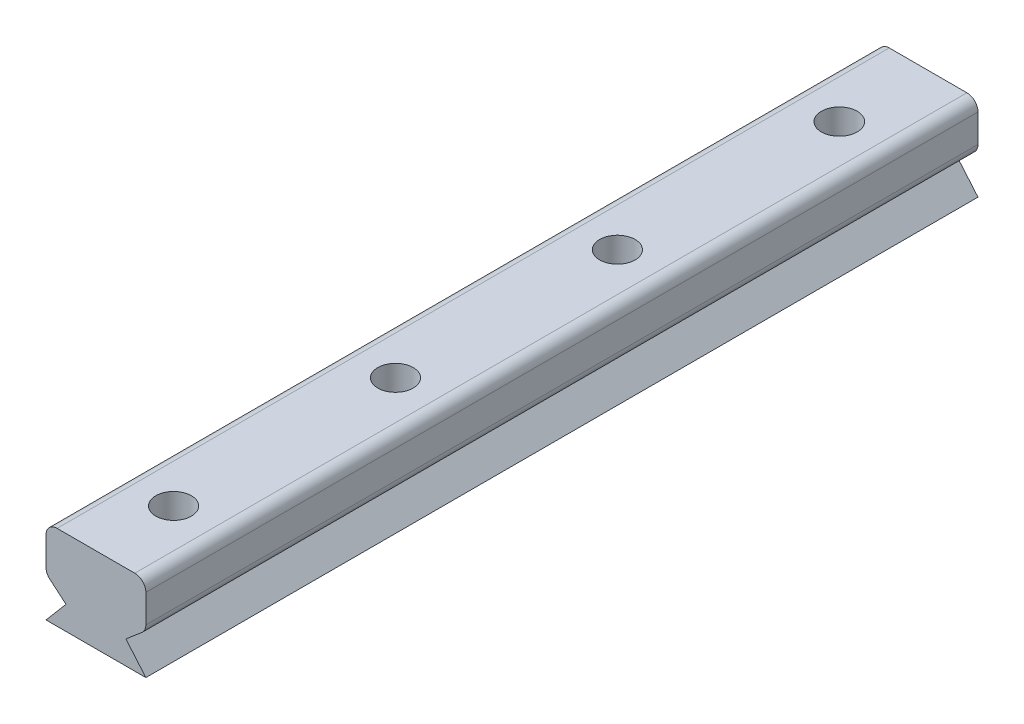
ISO-10303-21;
HEADER;
FILE_DESCRIPTION(('STEP AP214'),'2;1');
FILE_NAME('part.step','',(''),(''),'','','');
FILE_SCHEMA(('AUTOMOTIVE_DESIGN { 1 0 10303 214 1 1 1 1 }'));
ENDSEC;
DATA;
#1=APPLICATION_CONTEXT('core data for automotive mechanical design processes');
#2=APPLICATION_PROTOCOL_DEFINITION('international standard','automotive_design',2000,#1);
#3=PRODUCT_CONTEXT('',#1,'mechanical');
#4=PRODUCT('Part','Part','',(#3));
#5=PRODUCT_RELATED_PRODUCT_CATEGORY('part','',(#4));
#6=PRODUCT_DEFINITION_FORMATION('','',#4);
#7=PRODUCT_DEFINITION_CONTEXT('part definition',#1,'design');
#8=PRODUCT_DEFINITION('design','',#6,#7);
#9=PRODUCT_DEFINITION_SHAPE('','',#8);
#10=(LENGTH_UNIT() NAMED_UNIT(*) SI_UNIT(.MILLI.,.METRE.));
#11=(NAMED_UNIT(*) PLANE_ANGLE_UNIT() SI_UNIT($,.RADIAN.));
#12=(NAMED_UNIT(*) SI_UNIT($,.STERADIAN.) SOLID_ANGLE_UNIT());
#13=UNCERTAINTY_MEASURE_WITH_UNIT(LENGTH_MEASURE(1.E-05),#10,'distance_accuracy_value','');
#14=(GEOMETRIC_REPRESENTATION_CONTEXT(3) GLOBAL_UNCERTAINTY_ASSIGNED_CONTEXT((#13)) GLOBAL_UNIT_ASSIGNED_CONTEXT((#10,
#11,#12)) REPRESENTATION_CONTEXT('',''));
#15=CARTESIAN_POINT('',(0.,0.,0.));
#16=DIRECTION('',(0.,0.,1.));
#17=DIRECTION('',(1.,0.,0.));
#18=AXIS2_PLACEMENT_3D('',#15,#16,#17);
#19=CARTESIAN_POINT('',(0.,-4.,75.));
#20=DIRECTION('',(1.,0.,0.));
#21=DIRECTION('',(0.,0.,-1.));
#22=AXIS2_PLACEMENT_3D('',#19,#20,#21);
#23=PLANE('',#22);
#24=DIRECTION('',(0.,-1.,0.));
#25=VECTOR('',#24,1.);
#26=CARTESIAN_POINT('',(0.,-4.,0.));
#27=LINE('',#26,#25);
#28=CARTESIAN_POINT('',(0.,-1.,0.));
#29=VERTEX_POINT('',#28);
#30=CARTESIAN_POINT('',(0.,-3.53742585287471,0.));
#31=VERTEX_POINT('',#30);
#32=EDGE_CURVE('E164',#29,#31,#27,.T.);
#33=ORIENTED_EDGE('',*,*,#32,.T.);
#34=DIRECTION('',(0.,0.,-1.));
#35=VECTOR('',#34,1.);
#36=CARTESIAN_POINT('',(0.,-3.53742585287471,75.));
#37=LINE('',#36,#35);
#38=CARTESIAN_POINT('',(0.,-3.53742585287471,75.));
#39=VERTEX_POINT('',#38);
#40=EDGE_CURVE('E212',#31,#39,#37,.F.);
#41=ORIENTED_EDGE('',*,*,#40,.T.);
#42=DIRECTION('',(0.,-1.,0.));
#43=VECTOR('',#42,1.);
#44=CARTESIAN_POINT('',(0.,-4.,75.));
#45=LINE('',#44,#43);
#46=CARTESIAN_POINT('',(0.,-1.,75.));
#47=VERTEX_POINT('',#46);
#48=EDGE_CURVE('E134',#47,#39,#45,.T.);
#49=ORIENTED_EDGE('',*,*,#48,.F.);
#50=DIRECTION('',(0.,0.,-1.));
#51=VECTOR('',#50,1.);
#52=CARTESIAN_POINT('',(0.,-1.,75.));
#53=LINE('',#52,#51);
#54=EDGE_CURVE('E203',#47,#29,#53,.T.);
#55=ORIENTED_EDGE('',*,*,#54,.T.);
#56=EDGE_LOOP('',(#33,#41,#49,#55));
#57=FACE_BOUND('',#56,.T.);
#58=ADVANCED_FACE('F33',(#57),#23,.F.);
#59=CARTESIAN_POINT('',(1.8,-5.52931729316591,75.));
#60=DIRECTION('',(0.647480599666021,0.762081933295974,0.));
#61=DIRECTION('',(-0.762081933295974,0.647480599666022,0.));
#62=AXIS2_PLACEMENT_3D('',#59,#60,#61);
#63=PLANE('',#62);
#64=DIRECTION('',(0.762081933295974,-0.647480599666021,0.));
#65=VECTOR('',#64,1.);
#66=CARTESIAN_POINT('',(1.8,-5.52931729316591,75.));
#67=LINE('',#66,#65);
#68=CARTESIAN_POINT('',(0.352519400333979,-4.29950778617068,75.));
#69=VERTEX_POINT('',#68);
#70=CARTESIAN_POINT('',(1.8,-5.52931729316591,75.));
#71=VERTEX_POINT('',#70);
#72=EDGE_CURVE('E122',#69,#71,#67,.T.);
#73=ORIENTED_EDGE('',*,*,#72,.F.);
#74=DIRECTION('',(0.,0.,-1.));
#75=VECTOR('',#74,1.);
#76=CARTESIAN_POINT('',(0.352519400333979,-4.29950778617068,75.));
#77=LINE('',#76,#75);
#78=CARTESIAN_POINT('',(0.352519400333979,-4.29950778617068,0.));
#79=VERTEX_POINT('',#78);
#80=EDGE_CURVE('E206',#69,#79,#77,.T.);
#81=ORIENTED_EDGE('',*,*,#80,.T.);
#82=DIRECTION('',(0.762081933295974,-0.647480599666021,0.));
#83=VECTOR('',#82,1.);
#84=CARTESIAN_POINT('',(1.8,-5.52931729316591,0.));
#85=LINE('',#84,#83);
#86=CARTESIAN_POINT('',(1.8,-5.52931729316591,0.));
#87=VERTEX_POINT('',#86);
#88=EDGE_CURVE('E140',#79,#87,#85,.T.);
#89=ORIENTED_EDGE('',*,*,#88,.T.);
#90=DIRECTION('',(0.,0.,-1.));
#91=VECTOR('',#90,1.);
#92=CARTESIAN_POINT('',(1.8,-5.52931729316591,75.));
#93=LINE('',#92,#91);
#94=EDGE_CURVE('E137',#71,#87,#93,.T.);
#95=ORIENTED_EDGE('',*,*,#94,.F.);
#96=EDGE_LOOP('',(#73,#81,#89,#95));
#97=FACE_BOUND('',#96,.T.);
#98=ADVANCED_FACE('F138',(#97),#63,.F.);
#99=CARTESIAN_POINT('',(0.,-7.64790969676891,75.));
#100=DIRECTION('',(0.762081933295974,-0.647480599666022,0.));
#101=DIRECTION('',(0.647480599666022,0.762081933295974,0.));
#102=AXIS2_PLACEMENT_3D('',#99,#100,#101);
#103=PLANE('',#102);
#104=DIRECTION('',(-0.647480599666022,-0.762081933295974,0.));
#105=VECTOR('',#104,1.);
#106=CARTESIAN_POINT('',(0.,-7.64790969676891,0.));
#107=LINE('',#106,#105);
#108=CARTESIAN_POINT('',(0.,-7.64790969676891,0.));
#109=VERTEX_POINT('',#108);
#110=EDGE_CURVE('E168',#87,#109,#107,.T.);
#111=ORIENTED_EDGE('',*,*,#110,.T.);
#112=DIRECTION('',(0.,0.,-1.));
#113=VECTOR('',#112,1.);
#114=CARTESIAN_POINT('',(0.,-7.64790969676891,75.));
#115=LINE('',#114,#113);
#116=CARTESIAN_POINT('',(0.,-7.64790969676891,75.));
#117=VERTEX_POINT('',#116);
#118=EDGE_CURVE('E144',#117,#109,#115,.T.);
#119=ORIENTED_EDGE('',*,*,#118,.F.);
#120=DIRECTION('',(-0.647480599666022,-0.762081933295974,0.));
#121=VECTOR('',#120,1.);
#122=CARTESIAN_POINT('',(0.,-7.64790969676891,75.));
#123=LINE('',#122,#121);
#124=EDGE_CURVE('E127',#71,#117,#123,.T.);
#125=ORIENTED_EDGE('',*,*,#124,.F.);
#126=ORIENTED_EDGE('',*,*,#94,.T.);
#127=EDGE_LOOP('',(#111,#119,#125,#126));
#128=FACE_BOUND('',#127,.T.);
#129=ADVANCED_FACE('F146',(#128),#103,.F.);
#130=CARTESIAN_POINT('',(9.,-7.64790969676891,75.));
#131=DIRECTION('',(0.,1.,0.));
#132=DIRECTION('',(0.,0.,1.));
#133=AXIS2_PLACEMENT_3D('',#130,#131,#132);
#134=PLANE('',#133);
#135=CARTESIAN_POINT('',(4.50000000000001,-7.64790969676891,7.99999999999999));
#136=DIRECTION('',(0.,-1.,0.));
#137=DIRECTION('',(0.,0.,-1.));
#138=AXIS2_PLACEMENT_3D('',#135,#136,#137);
#139=CIRCLE('',#138,1.61718357872705);
#140=CARTESIAN_POINT('',(4.50000000000001,-7.64790969676891,6.38281642127293));
#141=VERTEX_POINT('',#140);
#142=EDGE_CURVE('E222',#141,#141,#139,.T.);
#143=ORIENTED_EDGE('',*,*,#142,.F.);
#144=EDGE_LOOP('',(#143));
#145=FACE_BOUND('',#144,.T.);
#146=CARTESIAN_POINT('',(4.5,-7.64790969676891,68.));
#147=DIRECTION('',(0.,-1.,0.));
#148=DIRECTION('',(0.,0.,-1.));
#149=AXIS2_PLACEMENT_3D('',#146,#147,#148);
#150=CIRCLE('',#149,1.6);
#151=CARTESIAN_POINT('',(4.5,-7.64790969676891,66.4));
#152=VERTEX_POINT('',#151);
#153=EDGE_CURVE('E430',#152,#152,#150,.T.);
#154=ORIENTED_EDGE('',*,*,#153,.F.);
#155=EDGE_LOOP('',(#154));
#156=FACE_BOUND('',#155,.T.);
#157=CARTESIAN_POINT('',(4.5,-7.64790969676891,48.));
#158=DIRECTION('',(0.,-1.,0.));
#159=DIRECTION('',(0.,0.,-1.));
#160=AXIS2_PLACEMENT_3D('',#157,#158,#159);
#161=CIRCLE('',#160,1.59999999999999);
#162=CARTESIAN_POINT('',(4.5,-7.64790969676891,46.4));
#163=VERTEX_POINT('',#162);
#164=EDGE_CURVE('E409',#163,#163,#161,.T.);
#165=ORIENTED_EDGE('',*,*,#164,.F.);
#166=EDGE_LOOP('',(#165));
#167=FACE_BOUND('',#166,.T.);
#168=CARTESIAN_POINT('',(4.50000000000001,-7.64790969676891,28.));
#169=DIRECTION('',(0.,-1.,0.));
#170=DIRECTION('',(0.,0.,-1.));
#171=AXIS2_PLACEMENT_3D('',#168,#169,#170);
#172=CIRCLE('',#171,1.6);
#173=CARTESIAN_POINT('',(4.50000000000001,-7.64790969676891,26.4));
#174=VERTEX_POINT('',#173);
#175=EDGE_CURVE('E426',#174,#174,#172,.T.);
#176=ORIENTED_EDGE('',*,*,#175,.F.);
#177=EDGE_LOOP('',(#176));
#178=FACE_BOUND('',#177,.T.);
#179=DIRECTION('',(1.,0.,0.));
#180=VECTOR('',#179,1.);
#181=CARTESIAN_POINT('',(9.,-7.64790969676891,0.));
#182=LINE('',#181,#180);
#183=CARTESIAN_POINT('',(9.,-7.64790969676891,0.));
#184=VERTEX_POINT('',#183);
#185=EDGE_CURVE('E170',#109,#184,#182,.T.);
#186=ORIENTED_EDGE('',*,*,#185,.T.);
#187=DIRECTION('',(0.,0.,-1.));
#188=VECTOR('',#187,1.);
#189=CARTESIAN_POINT('',(9.,-7.64790969676891,75.));
#190=LINE('',#189,#188);
#191=CARTESIAN_POINT('',(9.,-7.64790969676891,75.));
#192=VERTEX_POINT('',#191);
#193=EDGE_CURVE('E183',#192,#184,#190,.T.);
#194=ORIENTED_EDGE('',*,*,#193,.F.);
#195=DIRECTION('',(1.,0.,0.));
#196=VECTOR('',#195,1.);
#197=CARTESIAN_POINT('',(9.,-7.64790969676891,75.));
#198=LINE('',#197,#196);
#199=EDGE_CURVE('E149',#117,#192,#198,.T.);
#200=ORIENTED_EDGE('',*,*,#199,.F.);
#201=ORIENTED_EDGE('',*,*,#118,.T.);
#202=EDGE_LOOP('',(#186,#194,#200,#201));
#203=FACE_BOUND('',#202,.T.);
#204=ADVANCED_FACE('F276',(#145,#156,#167,#178,#203),#134,.F.);
#205=CARTESIAN_POINT('',(7.2,-5.52931729316591,75.));
#206=DIRECTION('',(-0.762081933295974,-0.647480599666022,0.));
#207=DIRECTION('',(0.647480599666022,-0.762081933295974,0.));
#208=AXIS2_PLACEMENT_3D('',#205,#206,#207);
#209=PLANE('',#208);
#210=DIRECTION('',(-0.647480599666022,0.762081933295974,0.));
#211=VECTOR('',#210,1.);
#212=CARTESIAN_POINT('',(7.2,-5.52931729316591,0.));
#213=LINE('',#212,#211);
#214=CARTESIAN_POINT('',(7.2,-5.52931729316591,0.));
#215=VERTEX_POINT('',#214);
#216=EDGE_CURVE('E172',#184,#215,#213,.T.);
#217=ORIENTED_EDGE('',*,*,#216,.T.);
#218=DIRECTION('',(0.,0.,-1.));
#219=VECTOR('',#218,1.);
#220=CARTESIAN_POINT('',(7.2,-5.52931729316591,75.));
#221=LINE('',#220,#219);
#222=CARTESIAN_POINT('',(7.2,-5.52931729316591,75.));
#223=VERTEX_POINT('',#222);
#224=EDGE_CURVE('E163',#223,#215,#221,.T.);
#225=ORIENTED_EDGE('',*,*,#224,.F.);
#226=DIRECTION('',(-0.647480599666022,0.762081933295974,0.));
#227=VECTOR('',#226,1.);
#228=CARTESIAN_POINT('',(7.2,-5.52931729316591,75.));
#229=LINE('',#228,#227);
#230=EDGE_CURVE('E151',#192,#223,#229,.T.);
#231=ORIENTED_EDGE('',*,*,#230,.F.);
#232=ORIENTED_EDGE('',*,*,#193,.T.);
#233=EDGE_LOOP('',(#217,#225,#231,#232));
#234=FACE_BOUND('',#233,.T.);
#235=ADVANCED_FACE('F281',(#234),#209,.F.);
#236=CARTESIAN_POINT('',(9.,-4.,75.));
#237=DIRECTION('',(-0.647480599666021,0.762081933295974,0.));
#238=DIRECTION('',(-0.762081933295974,-0.647480599666021,0.));
#239=AXIS2_PLACEMENT_3D('',#236,#237,#238);
#240=PLANE('',#239);
#241=DIRECTION('',(0.762081933295974,0.647480599666021,0.));
#242=VECTOR('',#241,1.);
#243=CARTESIAN_POINT('',(9.,-4.,0.));
#244=LINE('',#243,#242);
#245=CARTESIAN_POINT('',(8.64748059966602,-4.29950778617068,0.));
#246=VERTEX_POINT('',#245);
#247=EDGE_CURVE('E174',#215,#246,#244,.T.);
#248=ORIENTED_EDGE('',*,*,#247,.T.);
#249=DIRECTION('',(0.,0.,-1.));
#250=VECTOR('',#249,1.);
#251=CARTESIAN_POINT('',(8.64748059966602,-4.29950778617068,75.));
#252=LINE('',#251,#250);
#253=CARTESIAN_POINT('',(8.64748059966602,-4.29950778617068,75.));
#254=VERTEX_POINT('',#253);
#255=EDGE_CURVE('E11',#246,#254,#252,.F.);
#256=ORIENTED_EDGE('',*,*,#255,.T.);
#257=DIRECTION('',(0.762081933295974,0.647480599666021,0.));
#258=VECTOR('',#257,1.);
#259=CARTESIAN_POINT('',(9.,-4.,75.));
#260=LINE('',#259,#258);
#261=EDGE_CURVE('E156',#223,#254,#260,.T.);
#262=ORIENTED_EDGE('',*,*,#261,.F.);
#263=ORIENTED_EDGE('',*,*,#224,.T.);
#264=EDGE_LOOP('',(#248,#256,#262,#263));
#265=FACE_BOUND('',#264,.T.);
#266=ADVANCED_FACE('F283',(#265),#240,.F.);
#267=CARTESIAN_POINT('',(9.,0.,75.));
#268=DIRECTION('',(-1.,0.,0.));
#269=DIRECTION('',(0.,0.,1.));
#270=AXIS2_PLACEMENT_3D('',#267,#268,#269);
#271=PLANE('',#270);
#272=DIRECTION('',(0.,1.,0.));
#273=VECTOR('',#272,1.);
#274=CARTESIAN_POINT('',(9.,0.,75.));
#275=LINE('',#274,#273);
#276=CARTESIAN_POINT('',(9.,-3.53742585287471,75.));
#277=VERTEX_POINT('',#276);
#278=CARTESIAN_POINT('',(9.,-1.,75.));
#279=VERTEX_POINT('',#278);
#280=EDGE_CURVE('E158',#277,#279,#275,.T.);
#281=ORIENTED_EDGE('',*,*,#280,.F.);
#282=DIRECTION('',(0.,0.,-1.));
#283=VECTOR('',#282,1.);
#284=CARTESIAN_POINT('',(9.,-3.53742585287471,75.));
#285=LINE('',#284,#283);
#286=CARTESIAN_POINT('',(9.,-3.53742585287471,0.));
#287=VERTEX_POINT('',#286);
#288=EDGE_CURVE('E42',#277,#287,#285,.T.);
#289=ORIENTED_EDGE('',*,*,#288,.T.);
#290=DIRECTION('',(0.,1.,0.));
#291=VECTOR('',#290,1.);
#292=CARTESIAN_POINT('',(9.,0.,0.));
#293=LINE('',#292,#291);
#294=CARTESIAN_POINT('',(9.,-1.,0.));
#295=VERTEX_POINT('',#294);
#296=EDGE_CURVE('E176',#287,#295,#293,.T.);
#297=ORIENTED_EDGE('',*,*,#296,.T.);
#298=DIRECTION('',(0.,0.,-1.));
#299=VECTOR('',#298,1.);
#300=CARTESIAN_POINT('',(9.,-1.,75.));
#301=LINE('',#300,#299);
#302=EDGE_CURVE('E196',#295,#279,#301,.F.);
#303=ORIENTED_EDGE('',*,*,#302,.T.);
#304=EDGE_LOOP('',(#281,#289,#297,#303));
#305=FACE_BOUND('',#304,.T.);
#306=ADVANCED_FACE('F285',(#305),#271,.F.);
#307=CARTESIAN_POINT('',(0.,0.,75.));
#308=DIRECTION('',(0.,-1.,0.));
#309=DIRECTION('',(0.,0.,-1.));
#310=AXIS2_PLACEMENT_3D('',#307,#308,#309);
#311=PLANE('',#310);
#312=CARTESIAN_POINT('',(4.50000000000001,0.,7.99999999999999));
#313=DIRECTION('',(0.,-1.,0.));
#314=DIRECTION('',(0.,0.,-1.));
#315=AXIS2_PLACEMENT_3D('',#312,#313,#314);
#316=CIRCLE('',#315,1.61718357872705);
#317=CARTESIAN_POINT('',(4.50000000000001,0.,6.38281642127293));
#318=VERTEX_POINT('',#317);
#319=EDGE_CURVE('E37',#318,#318,#316,.T.);
#320=ORIENTED_EDGE('',*,*,#319,.T.);
#321=EDGE_LOOP('',(#320));
#322=FACE_BOUND('',#321,.T.);
#323=CARTESIAN_POINT('',(4.5,0.,68.));
#324=DIRECTION('',(0.,-1.,0.));
#325=DIRECTION('',(0.,0.,-1.));
#326=AXIS2_PLACEMENT_3D('',#323,#324,#325);
#327=CIRCLE('',#326,1.6);
#328=CARTESIAN_POINT('',(4.5,0.,66.4));
#329=VERTEX_POINT('',#328);
#330=EDGE_CURVE('E224',#329,#329,#327,.T.);
#331=ORIENTED_EDGE('',*,*,#330,.T.);
#332=EDGE_LOOP('',(#331));
#333=FACE_BOUND('',#332,.T.);
#334=CARTESIAN_POINT('',(4.5,0.,48.));
#335=DIRECTION('',(0.,-1.,0.));
#336=DIRECTION('',(0.,0.,-1.));
#337=AXIS2_PLACEMENT_3D('',#334,#335,#336);
#338=CIRCLE('',#337,1.59999999999999);
#339=CARTESIAN_POINT('',(4.5,0.,46.4));
#340=VERTEX_POINT('',#339);
#341=EDGE_CURVE('E221',#340,#340,#338,.T.);
#342=ORIENTED_EDGE('',*,*,#341,.T.);
#343=EDGE_LOOP('',(#342));
#344=FACE_BOUND('',#343,.T.);
#345=CARTESIAN_POINT('',(4.50000000000001,0.,28.));
#346=DIRECTION('',(0.,-1.,0.));
#347=DIRECTION('',(0.,0.,-1.));
#348=AXIS2_PLACEMENT_3D('',#345,#346,#347);
#349=CIRCLE('',#348,1.6);
#350=CARTESIAN_POINT('',(4.50000000000001,0.,26.4));
#351=VERTEX_POINT('',#350);
#352=EDGE_CURVE('E218',#351,#351,#349,.T.);
#353=ORIENTED_EDGE('',*,*,#352,.T.);
#354=EDGE_LOOP('',(#353));
#355=FACE_BOUND('',#354,.T.);
#356=DIRECTION('',(-1.,0.,0.));
#357=VECTOR('',#356,1.);
#358=CARTESIAN_POINT('',(0.,0.,75.));
#359=LINE('',#358,#357);
#360=CARTESIAN_POINT('',(8.,0.,75.));
#361=VERTEX_POINT('',#360);
#362=CARTESIAN_POINT('',(1.,0.,75.));
#363=VERTEX_POINT('',#362);
#364=EDGE_CURVE('E160',#361,#363,#359,.T.);
#365=ORIENTED_EDGE('',*,*,#364,.F.);
#366=DIRECTION('',(0.,0.,-1.));
#367=VECTOR('',#366,1.);
#368=CARTESIAN_POINT('',(8.,0.,75.));
#369=LINE('',#368,#367);
#370=CARTESIAN_POINT('',(8.,0.,0.));
#371=VERTEX_POINT('',#370);
#372=EDGE_CURVE('E188',#361,#371,#369,.T.);
#373=ORIENTED_EDGE('',*,*,#372,.T.);
#374=DIRECTION('',(-1.,0.,0.));
#375=VECTOR('',#374,1.);
#376=CARTESIAN_POINT('',(0.,0.,0.));
#377=LINE('',#376,#375);
#378=CARTESIAN_POINT('',(1.,0.,0.));
#379=VERTEX_POINT('',#378);
#380=EDGE_CURVE('E178',#371,#379,#377,.T.);
#381=ORIENTED_EDGE('',*,*,#380,.T.);
#382=DIRECTION('',(0.,0.,-1.));
#383=VECTOR('',#382,1.);
#384=CARTESIAN_POINT('',(1.,0.,75.));
#385=LINE('',#384,#383);
#386=EDGE_CURVE('E143',#379,#363,#385,.F.);
#387=ORIENTED_EDGE('',*,*,#386,.T.);
#388=EDGE_LOOP('',(#365,#373,#381,#387));
#389=FACE_BOUND('',#388,.T.);
#390=ADVANCED_FACE('F231',(#322,#333,#344,#355,#389),#311,.F.);
#391=CARTESIAN_POINT('',(0.,0.,75.));
#392=DIRECTION('',(0.,0.,-1.));
#393=DIRECTION('',(-1.,0.,0.));
#394=AXIS2_PLACEMENT_3D('',#391,#392,#393);
#395=PLANE('',#394);
#396=ORIENTED_EDGE('',*,*,#48,.T.);
#397=CARTESIAN_POINT('',(1.,-3.53742585287471,75.));
#398=DIRECTION('',(0.,0.,-1.));
#399=DIRECTION('',(-1.,0.,0.));
#400=AXIS2_PLACEMENT_3D('',#397,#398,#399);
#401=CIRCLE('',#400,1.);
#402=EDGE_CURVE('E130',#39,#69,#401,.F.);
#403=ORIENTED_EDGE('',*,*,#402,.T.);
#404=ORIENTED_EDGE('',*,*,#72,.T.);
#405=ORIENTED_EDGE('',*,*,#124,.T.);
#406=ORIENTED_EDGE('',*,*,#199,.T.);
#407=ORIENTED_EDGE('',*,*,#230,.T.);
#408=ORIENTED_EDGE('',*,*,#261,.T.);
#409=CARTESIAN_POINT('',(8.,-3.53742585287471,75.));
#410=DIRECTION('',(0.,0.,-1.));
#411=DIRECTION('',(-1.,0.,0.));
#412=AXIS2_PLACEMENT_3D('',#409,#410,#411);
#413=CIRCLE('',#412,1.);
#414=EDGE_CURVE('E55',#254,#277,#413,.F.);
#415=ORIENTED_EDGE('',*,*,#414,.T.);
#416=ORIENTED_EDGE('',*,*,#280,.T.);
#417=CARTESIAN_POINT('',(8.,-1.,75.));
#418=DIRECTION('',(0.,0.,-1.));
#419=DIRECTION('',(-1.,0.,0.));
#420=AXIS2_PLACEMENT_3D('',#417,#418,#419);
#421=CIRCLE('',#420,1.);
#422=EDGE_CURVE('E201',#279,#361,#421,.F.);
#423=ORIENTED_EDGE('',*,*,#422,.T.);
#424=ORIENTED_EDGE('',*,*,#364,.T.);
#425=CARTESIAN_POINT('',(1.,-1.,75.));
#426=DIRECTION('',(0.,0.,-1.));
#427=DIRECTION('',(-1.,0.,0.));
#428=AXIS2_PLACEMENT_3D('',#425,#426,#427);
#429=CIRCLE('',#428,1.);
#430=EDGE_CURVE('E199',#363,#47,#429,.F.);
#431=ORIENTED_EDGE('',*,*,#430,.T.);
#432=EDGE_LOOP('',(#396,#403,#404,#405,#406,#407,#408,#415,#416,#423,#424,#431));
#433=FACE_BOUND('',#432,.T.);
#434=ADVANCED_FACE('F125',(#433),#395,.F.);
#435=CARTESIAN_POINT('',(0.,0.,0.));
#436=DIRECTION('',(0.,0.,-1.));
#437=DIRECTION('',(-1.,0.,0.));
#438=AXIS2_PLACEMENT_3D('',#435,#436,#437);
#439=PLANE('',#438);
#440=ORIENTED_EDGE('',*,*,#88,.F.);
#441=CARTESIAN_POINT('',(1.,-3.53742585287471,0.));
#442=DIRECTION('',(0.,0.,-1.));
#443=DIRECTION('',(-1.,0.,0.));
#444=AXIS2_PLACEMENT_3D('',#441,#442,#443);
#445=CIRCLE('',#444,1.);
#446=EDGE_CURVE('E210',#79,#31,#445,.T.);
#447=ORIENTED_EDGE('',*,*,#446,.T.);
#448=ORIENTED_EDGE('',*,*,#32,.F.);
#449=CARTESIAN_POINT('',(1.,-1.,0.));
#450=DIRECTION('',(0.,0.,-1.));
#451=DIRECTION('',(-1.,0.,0.));
#452=AXIS2_PLACEMENT_3D('',#449,#450,#451);
#453=CIRCLE('',#452,1.);
#454=EDGE_CURVE('E191',#29,#379,#453,.T.);
#455=ORIENTED_EDGE('',*,*,#454,.T.);
#456=ORIENTED_EDGE('',*,*,#380,.F.);
#457=CARTESIAN_POINT('',(8.,-1.,0.));
#458=DIRECTION('',(0.,0.,-1.));
#459=DIRECTION('',(-1.,0.,0.));
#460=AXIS2_PLACEMENT_3D('',#457,#458,#459);
#461=CIRCLE('',#460,1.);
#462=EDGE_CURVE('E193',#371,#295,#461,.T.);
#463=ORIENTED_EDGE('',*,*,#462,.T.);
#464=ORIENTED_EDGE('',*,*,#296,.F.);
#465=CARTESIAN_POINT('',(8.,-3.53742585287471,0.));
#466=DIRECTION('',(0.,0.,-1.));
#467=DIRECTION('',(-1.,0.,0.));
#468=AXIS2_PLACEMENT_3D('',#465,#466,#467);
#469=CIRCLE('',#468,1.);
#470=EDGE_CURVE('E208',#287,#246,#469,.T.);
#471=ORIENTED_EDGE('',*,*,#470,.T.);
#472=ORIENTED_EDGE('',*,*,#247,.F.);
#473=ORIENTED_EDGE('',*,*,#216,.F.);
#474=ORIENTED_EDGE('',*,*,#185,.F.);
#475=ORIENTED_EDGE('',*,*,#110,.F.);
#476=EDGE_LOOP('',(#440,#447,#448,#455,#456,#463,#464,#471,#472,#473,#474,#475));
#477=FACE_BOUND('',#476,.T.);
#478=ADVANCED_FACE('F258',(#477),#439,.T.);
#479=CARTESIAN_POINT('',(8.,-1.,75.));
#480=DIRECTION('',(0.,0.,-1.));
#481=DIRECTION('',(-1.,0.,0.));
#482=AXIS2_PLACEMENT_3D('',#479,#480,#481);
#483=CYLINDRICAL_SURFACE('',#482,1.);
#484=ORIENTED_EDGE('',*,*,#422,.F.);
#485=ORIENTED_EDGE('',*,*,#302,.F.);
#486=ORIENTED_EDGE('',*,*,#462,.F.);
#487=ORIENTED_EDGE('',*,*,#372,.F.);
#488=EDGE_LOOP('',(#484,#485,#486,#487));
#489=FACE_BOUND('',#488,.T.);
#490=ADVANCED_FACE('F254',(#489),#483,.T.);
#491=CARTESIAN_POINT('',(1.,-1.,75.));
#492=DIRECTION('',(0.,0.,-1.));
#493=DIRECTION('',(-1.,0.,0.));
#494=AXIS2_PLACEMENT_3D('',#491,#492,#493);
#495=CYLINDRICAL_SURFACE('',#494,1.);
#496=ORIENTED_EDGE('',*,*,#430,.F.);
#497=ORIENTED_EDGE('',*,*,#386,.F.);
#498=ORIENTED_EDGE('',*,*,#454,.F.);
#499=ORIENTED_EDGE('',*,*,#54,.F.);
#500=EDGE_LOOP('',(#496,#497,#498,#499));
#501=FACE_BOUND('',#500,.T.);
#502=ADVANCED_FACE('F257',(#501),#495,.T.);
#503=CARTESIAN_POINT('',(1.,-3.53742585287471,75.));
#504=DIRECTION('',(0.,0.,-1.));
#505=DIRECTION('',(-1.,0.,0.));
#506=AXIS2_PLACEMENT_3D('',#503,#504,#505);
#507=CYLINDRICAL_SURFACE('',#506,1.);
#508=ORIENTED_EDGE('',*,*,#402,.F.);
#509=ORIENTED_EDGE('',*,*,#40,.F.);
#510=ORIENTED_EDGE('',*,*,#446,.F.);
#511=ORIENTED_EDGE('',*,*,#80,.F.);
#512=EDGE_LOOP('',(#508,#509,#510,#511));
#513=FACE_BOUND('',#512,.T.);
#514=ADVANCED_FACE('F261',(#513),#507,.T.);
#515=CARTESIAN_POINT('',(8.,-3.53742585287471,75.));
#516=DIRECTION('',(0.,0.,-1.));
#517=DIRECTION('',(-1.,0.,0.));
#518=AXIS2_PLACEMENT_3D('',#515,#516,#517);
#519=CYLINDRICAL_SURFACE('',#518,1.);
#520=ORIENTED_EDGE('',*,*,#414,.F.);
#521=ORIENTED_EDGE('',*,*,#255,.F.);
#522=ORIENTED_EDGE('',*,*,#470,.F.);
#523=ORIENTED_EDGE('',*,*,#288,.F.);
#524=EDGE_LOOP('',(#520,#521,#522,#523));
#525=FACE_BOUND('',#524,.T.);
#526=ADVANCED_FACE('F35',(#525),#519,.T.);
#527=CARTESIAN_POINT('',(4.50000000000001,6.35209030323109,28.));
#528=DIRECTION('',(0.,-1.,0.));
#529=DIRECTION('',(0.,0.,-1.));
#530=AXIS2_PLACEMENT_3D('',#527,#528,#529);
#531=CYLINDRICAL_SURFACE('',#530,1.6);
#532=ORIENTED_EDGE('',*,*,#175,.T.);
#533=EDGE_LOOP('',(#532));
#534=FACE_BOUND('',#533,.T.);
#535=ORIENTED_EDGE('',*,*,#352,.F.);
#536=EDGE_LOOP('',(#535));
#537=FACE_BOUND('',#536,.T.);
#538=ADVANCED_FACE('F268',(#534,#537),#531,.F.);
#539=CARTESIAN_POINT('',(4.5,6.35209030323109,48.));
#540=DIRECTION('',(0.,-1.,0.));
#541=DIRECTION('',(0.,0.,-1.));
#542=AXIS2_PLACEMENT_3D('',#539,#540,#541);
#543=CYLINDRICAL_SURFACE('',#542,1.59999999999999);
#544=ORIENTED_EDGE('',*,*,#164,.T.);
#545=EDGE_LOOP('',(#544));
#546=FACE_BOUND('',#545,.T.);
#547=ORIENTED_EDGE('',*,*,#341,.F.);
#548=EDGE_LOOP('',(#547));
#549=FACE_BOUND('',#548,.T.);
#550=ADVANCED_FACE('F241',(#546,#549),#543,.F.);
#551=CARTESIAN_POINT('',(4.5,6.35209030323109,68.));
#552=DIRECTION('',(0.,-1.,0.));
#553=DIRECTION('',(0.,0.,-1.));
#554=AXIS2_PLACEMENT_3D('',#551,#552,#553);
#555=CYLINDRICAL_SURFACE('',#554,1.6);
#556=ORIENTED_EDGE('',*,*,#153,.T.);
#557=EDGE_LOOP('',(#556));
#558=FACE_BOUND('',#557,.T.);
#559=ORIENTED_EDGE('',*,*,#330,.F.);
#560=EDGE_LOOP('',(#559));
#561=FACE_BOUND('',#560,.T.);
#562=ADVANCED_FACE('F235',(#558,#561),#555,.F.);
#563=CARTESIAN_POINT('',(4.50000000000001,6.35209030323109,7.99999999999999));
#564=DIRECTION('',(0.,-1.,0.));
#565=DIRECTION('',(0.,0.,-1.));
#566=AXIS2_PLACEMENT_3D('',#563,#564,#565);
#567=CYLINDRICAL_SURFACE('',#566,1.61718357872705);
#568=ORIENTED_EDGE('',*,*,#142,.T.);
#569=EDGE_LOOP('',(#568));
#570=FACE_BOUND('',#569,.T.);
#571=ORIENTED_EDGE('',*,*,#319,.F.);
#572=EDGE_LOOP('',(#571));
#573=FACE_BOUND('',#572,.T.);
#574=ADVANCED_FACE('F233',(#570,#573),#567,.F.);
#575=CLOSED_SHELL('',(#58,#98,#129,#204,#235,#266,#306,#390,#434,#478,#490,#502,#514,#526,#538,
#550,#562,#574));
#576=MANIFOLD_SOLID_BREP('B2',#575);
#577=ADVANCED_BREP_SHAPE_REPRESENTATION('',(#18,#576),#14);
#578=SHAPE_DEFINITION_REPRESENTATION(#9,#577);
ENDSEC;
END-ISO-10303-21;
